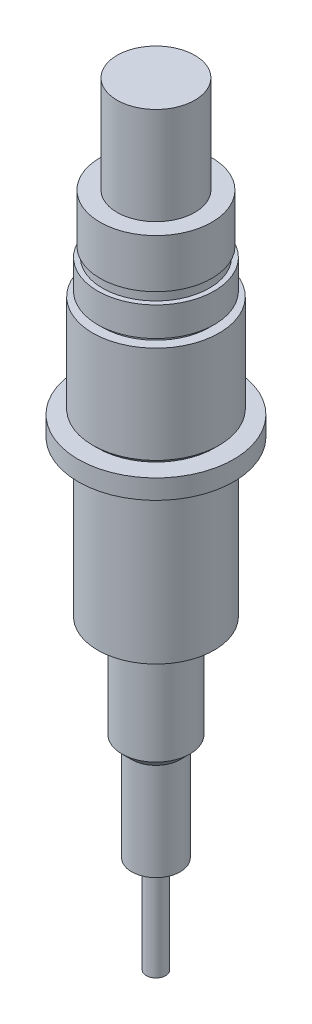
ISO-10303-21;
HEADER;
FILE_DESCRIPTION(('STEP AP214'),'2;1');
FILE_NAME('part.step','',(''),(''),'','','');
FILE_SCHEMA(('AUTOMOTIVE_DESIGN { 1 0 10303 214 1 1 1 1 }'));
ENDSEC;
DATA;
#1=APPLICATION_CONTEXT('core data for automotive mechanical design processes');
#2=APPLICATION_PROTOCOL_DEFINITION('international standard','automotive_design',2000,#1);
#3=PRODUCT_CONTEXT('',#1,'mechanical');
#4=PRODUCT('Part','Part','',(#3));
#5=PRODUCT_RELATED_PRODUCT_CATEGORY('part','',(#4));
#6=PRODUCT_DEFINITION_FORMATION('','',#4);
#7=PRODUCT_DEFINITION_CONTEXT('part definition',#1,'design');
#8=PRODUCT_DEFINITION('design','',#6,#7);
#9=PRODUCT_DEFINITION_SHAPE('','',#8);
#10=(LENGTH_UNIT() NAMED_UNIT(*) SI_UNIT(.MILLI.,.METRE.));
#11=(NAMED_UNIT(*) PLANE_ANGLE_UNIT() SI_UNIT($,.RADIAN.));
#12=(NAMED_UNIT(*) SI_UNIT($,.STERADIAN.) SOLID_ANGLE_UNIT());
#13=UNCERTAINTY_MEASURE_WITH_UNIT(LENGTH_MEASURE(1.E-05),#10,'distance_accuracy_value','');
#14=(GEOMETRIC_REPRESENTATION_CONTEXT(3) GLOBAL_UNCERTAINTY_ASSIGNED_CONTEXT((#13)) GLOBAL_UNIT_ASSIGNED_CONTEXT((#10,
#11,#12)) REPRESENTATION_CONTEXT('',''));
#15=CARTESIAN_POINT('',(0.,0.,0.));
#16=DIRECTION('',(0.,0.,1.));
#17=DIRECTION('',(1.,0.,0.));
#18=AXIS2_PLACEMENT_3D('',#15,#16,#17);
#19=CARTESIAN_POINT('',(0.,-47.5,0.));
#20=DIRECTION('',(0.,1.,0.));
#21=DIRECTION('',(0.,0.,1.));
#22=AXIS2_PLACEMENT_3D('',#19,#20,#21);
#23=PLANE('',#22);
#24=CARTESIAN_POINT('',(0.,-47.5,0.));
#25=DIRECTION('',(0.,1.,0.));
#26=DIRECTION('',(0.,0.,1.));
#27=AXIS2_PLACEMENT_3D('',#24,#25,#26);
#28=CIRCLE('',#27,1.);
#29=CARTESIAN_POINT('',(0.,-47.5,0.999999999999986));
#30=VERTEX_POINT('',#29);
#31=EDGE_CURVE('E10',#30,#30,#28,.T.);
#32=ORIENTED_EDGE('',*,*,#31,.F.);
#33=EDGE_LOOP('',(#32));
#34=FACE_BOUND('',#33,.T.);
#35=ADVANCED_FACE('F37',(#34),#23,.F.);
#36=CARTESIAN_POINT('',(0.,32.,0.));
#37=DIRECTION('',(0.,1.,0.));
#38=DIRECTION('',(0.,0.,1.));
#39=AXIS2_PLACEMENT_3D('',#36,#37,#38);
#40=CYLINDRICAL_SURFACE('',#39,1.);
#41=CARTESIAN_POINT('',(0.,-37.5,0.));
#42=DIRECTION('',(0.,1.,0.));
#43=DIRECTION('',(0.,0.,1.));
#44=AXIS2_PLACEMENT_3D('',#41,#42,#43);
#45=CIRCLE('',#44,1.);
#46=CARTESIAN_POINT('',(0.,-37.5,0.99999999999999));
#47=VERTEX_POINT('',#46);
#48=EDGE_CURVE('E44',#47,#47,#45,.T.);
#49=ORIENTED_EDGE('',*,*,#48,.F.);
#50=EDGE_LOOP('',(#49));
#51=FACE_BOUND('',#50,.T.);
#52=ORIENTED_EDGE('',*,*,#31,.T.);
#53=EDGE_LOOP('',(#52));
#54=FACE_BOUND('',#53,.T.);
#55=ADVANCED_FACE('F291',(#51,#54),#40,.T.);
#56=CARTESIAN_POINT('',(0.,-37.5,-1.00000000000001));
#57=DIRECTION('',(0.,1.,0.));
#58=DIRECTION('',(0.,0.,1.));
#59=AXIS2_PLACEMENT_3D('',#56,#57,#58);
#60=PLANE('',#59);
#61=CARTESIAN_POINT('',(0.,-37.5,0.));
#62=DIRECTION('',(0.,1.,0.));
#63=DIRECTION('',(0.,0.,1.));
#64=AXIS2_PLACEMENT_3D('',#61,#62,#63);
#65=CIRCLE('',#64,2.49999999999999);
#66=CARTESIAN_POINT('',(0.,-37.5,2.49999999999998));
#67=VERTEX_POINT('',#66);
#68=EDGE_CURVE('E49',#67,#67,#65,.T.);
#69=ORIENTED_EDGE('',*,*,#68,.F.);
#70=EDGE_LOOP('',(#69));
#71=FACE_BOUND('',#70,.T.);
#72=ORIENTED_EDGE('',*,*,#48,.T.);
#73=EDGE_LOOP('',(#72));
#74=FACE_BOUND('',#73,.T.);
#75=ADVANCED_FACE('F286',(#71,#74),#60,.F.);
#76=CARTESIAN_POINT('',(0.,32.,0.));
#77=DIRECTION('',(0.,1.,0.));
#78=DIRECTION('',(0.,0.,1.));
#79=AXIS2_PLACEMENT_3D('',#76,#77,#78);
#80=CYLINDRICAL_SURFACE('',#79,2.49999999999999);
#81=CARTESIAN_POINT('',(0.,-27.5,0.));
#82=DIRECTION('',(0.,1.,0.));
#83=DIRECTION('',(0.,0.,1.));
#84=AXIS2_PLACEMENT_3D('',#81,#82,#83);
#85=CIRCLE('',#84,2.5);
#86=CARTESIAN_POINT('',(0.,-27.5,2.49999999999999));
#87=VERTEX_POINT('',#86);
#88=EDGE_CURVE('E54',#87,#87,#85,.T.);
#89=ORIENTED_EDGE('',*,*,#88,.F.);
#90=EDGE_LOOP('',(#89));
#91=FACE_BOUND('',#90,.T.);
#92=ORIENTED_EDGE('',*,*,#68,.T.);
#93=EDGE_LOOP('',(#92));
#94=FACE_BOUND('',#93,.T.);
#95=ADVANCED_FACE('F280',(#91,#94),#80,.T.);
#96=CARTESIAN_POINT('',(0.,-27.5,0.));
#97=DIRECTION('',(0.,1.,0.));
#98=DIRECTION('',(0.,0.,1.));
#99=AXIS2_PLACEMENT_3D('',#96,#97,#98);
#100=CONICAL_SURFACE('',#99,2.5,0.785398163397448);
#101=CARTESIAN_POINT('',(0.,-26.5,0.));
#102=DIRECTION('',(0.,1.,0.));
#103=DIRECTION('',(0.,0.,1.));
#104=AXIS2_PLACEMENT_3D('',#101,#102,#103);
#105=CIRCLE('',#104,3.5);
#106=CARTESIAN_POINT('',(0.,-26.5,3.49999999999999));
#107=VERTEX_POINT('',#106);
#108=EDGE_CURVE('E60',#107,#107,#105,.T.);
#109=ORIENTED_EDGE('',*,*,#108,.F.);
#110=EDGE_LOOP('',(#109));
#111=FACE_BOUND('',#110,.T.);
#112=ORIENTED_EDGE('',*,*,#88,.T.);
#113=EDGE_LOOP('',(#112));
#114=FACE_BOUND('',#113,.T.);
#115=ADVANCED_FACE('F274',(#111,#114),#100,.T.);
#116=CARTESIAN_POINT('',(0.,32.,0.));
#117=DIRECTION('',(0.,1.,0.));
#118=DIRECTION('',(0.,0.,1.));
#119=AXIS2_PLACEMENT_3D('',#116,#117,#118);
#120=CYLINDRICAL_SURFACE('',#119,3.5);
#121=CARTESIAN_POINT('',(0.,-16.5,0.));
#122=DIRECTION('',(0.,1.,0.));
#123=DIRECTION('',(0.,0.,1.));
#124=AXIS2_PLACEMENT_3D('',#121,#122,#123);
#125=CIRCLE('',#124,3.5);
#126=CARTESIAN_POINT('',(0.,-16.5,3.49999999999999));
#127=VERTEX_POINT('',#126);
#128=EDGE_CURVE('E64',#127,#127,#125,.T.);
#129=ORIENTED_EDGE('',*,*,#128,.F.);
#130=EDGE_LOOP('',(#129));
#131=FACE_BOUND('',#130,.T.);
#132=ORIENTED_EDGE('',*,*,#108,.T.);
#133=EDGE_LOOP('',(#132));
#134=FACE_BOUND('',#133,.T.);
#135=ADVANCED_FACE('F268',(#131,#134),#120,.T.);
#136=CARTESIAN_POINT('',(0.,-16.5,-3.50000000000001));
#137=DIRECTION('',(0.,-1.,0.));
#138=DIRECTION('',(0.,0.,-1.));
#139=AXIS2_PLACEMENT_3D('',#136,#137,#138);
#140=PLANE('',#139);
#141=CARTESIAN_POINT('',(0.,-16.5,0.));
#142=DIRECTION('',(0.,1.,0.));
#143=DIRECTION('',(0.,0.,1.));
#144=AXIS2_PLACEMENT_3D('',#141,#142,#143);
#145=CIRCLE('',#144,3.);
#146=CARTESIAN_POINT('',(0.,-16.5,2.99999999999999));
#147=VERTEX_POINT('',#146);
#148=EDGE_CURVE('E68',#147,#147,#145,.T.);
#149=ORIENTED_EDGE('',*,*,#148,.F.);
#150=EDGE_LOOP('',(#149));
#151=FACE_BOUND('',#150,.T.);
#152=ORIENTED_EDGE('',*,*,#128,.T.);
#153=EDGE_LOOP('',(#152));
#154=FACE_BOUND('',#153,.T.);
#155=ADVANCED_FACE('F262',(#151,#154),#140,.F.);
#156=CARTESIAN_POINT('',(0.,32.,0.));
#157=DIRECTION('',(0.,1.,0.));
#158=DIRECTION('',(0.,0.,1.));
#159=AXIS2_PLACEMENT_3D('',#156,#157,#158);
#160=CYLINDRICAL_SURFACE('',#159,3.);
#161=CARTESIAN_POINT('',(0.,-16.,0.));
#162=DIRECTION('',(0.,1.,0.));
#163=DIRECTION('',(0.,0.,1.));
#164=AXIS2_PLACEMENT_3D('',#161,#162,#163);
#165=CIRCLE('',#164,3.);
#166=CARTESIAN_POINT('',(0.,-16.,2.99999999999999));
#167=VERTEX_POINT('',#166);
#168=EDGE_CURVE('E72',#167,#167,#165,.T.);
#169=ORIENTED_EDGE('',*,*,#168,.F.);
#170=EDGE_LOOP('',(#169));
#171=FACE_BOUND('',#170,.T.);
#172=ORIENTED_EDGE('',*,*,#148,.T.);
#173=EDGE_LOOP('',(#172));
#174=FACE_BOUND('',#173,.T.);
#175=ADVANCED_FACE('F256',(#171,#174),#160,.T.);
#176=CARTESIAN_POINT('',(0.,-16.,-3.00000000000001));
#177=DIRECTION('',(0.,1.,0.));
#178=DIRECTION('',(0.,0.,1.));
#179=AXIS2_PLACEMENT_3D('',#176,#177,#178);
#180=PLANE('',#179);
#181=CARTESIAN_POINT('',(0.,-16.,0.));
#182=DIRECTION('',(0.,1.,0.));
#183=DIRECTION('',(0.,0.,1.));
#184=AXIS2_PLACEMENT_3D('',#181,#182,#183);
#185=CIRCLE('',#184,6.);
#186=CARTESIAN_POINT('',(0.,-16.,5.99999999999999));
#187=VERTEX_POINT('',#186);
#188=EDGE_CURVE('E76',#187,#187,#185,.T.);
#189=ORIENTED_EDGE('',*,*,#188,.F.);
#190=EDGE_LOOP('',(#189));
#191=FACE_BOUND('',#190,.T.);
#192=ORIENTED_EDGE('',*,*,#168,.T.);
#193=EDGE_LOOP('',(#192));
#194=FACE_BOUND('',#193,.T.);
#195=ADVANCED_FACE('F250',(#191,#194),#180,.F.);
#196=CARTESIAN_POINT('',(0.,32.,0.));
#197=DIRECTION('',(0.,1.,0.));
#198=DIRECTION('',(0.,0.,1.));
#199=AXIS2_PLACEMENT_3D('',#196,#197,#198);
#200=CYLINDRICAL_SURFACE('',#199,6.);
#201=CARTESIAN_POINT('',(0.,-1.,0.));
#202=DIRECTION('',(0.,1.,0.));
#203=DIRECTION('',(0.,0.,1.));
#204=AXIS2_PLACEMENT_3D('',#201,#202,#203);
#205=CIRCLE('',#204,6.00000000000001);
#206=CARTESIAN_POINT('',(0.,-1.,6.));
#207=VERTEX_POINT('',#206);
#208=EDGE_CURVE('E80',#207,#207,#205,.T.);
#209=ORIENTED_EDGE('',*,*,#208,.F.);
#210=EDGE_LOOP('',(#209));
#211=FACE_BOUND('',#210,.T.);
#212=ORIENTED_EDGE('',*,*,#188,.T.);
#213=EDGE_LOOP('',(#212));
#214=FACE_BOUND('',#213,.T.);
#215=ADVANCED_FACE('F244',(#211,#214),#200,.T.);
#216=CARTESIAN_POINT('',(0.,-1.,0.));
#217=DIRECTION('',(0.,-1.,0.));
#218=DIRECTION('',(0.,0.,-1.));
#219=AXIS2_PLACEMENT_3D('',#216,#217,#218);
#220=CONICAL_SURFACE('',#219,6.00000000000001,0.785398163397452);
#221=CARTESIAN_POINT('',(0.,0.,0.));
#222=DIRECTION('',(0.,1.,0.));
#223=DIRECTION('',(0.,0.,1.));
#224=AXIS2_PLACEMENT_3D('',#221,#222,#223);
#225=CIRCLE('',#224,5.);
#226=CARTESIAN_POINT('',(0.,0.,4.99999999999999));
#227=VERTEX_POINT('',#226);
#228=EDGE_CURVE('E84',#227,#227,#225,.T.);
#229=ORIENTED_EDGE('',*,*,#228,.F.);
#230=EDGE_LOOP('',(#229));
#231=FACE_BOUND('',#230,.T.);
#232=ORIENTED_EDGE('',*,*,#208,.T.);
#233=EDGE_LOOP('',(#232));
#234=FACE_BOUND('',#233,.T.);
#235=ADVANCED_FACE('F238',(#231,#234),#220,.T.);
#236=CARTESIAN_POINT('',(0.,0.,-5.));
#237=DIRECTION('',(0.,1.,0.));
#238=DIRECTION('',(0.,0.,1.));
#239=AXIS2_PLACEMENT_3D('',#236,#237,#238);
#240=PLANE('',#239);
#241=CARTESIAN_POINT('',(0.,0.,0.));
#242=DIRECTION('',(0.,1.,0.));
#243=DIRECTION('',(0.,0.,1.));
#244=AXIS2_PLACEMENT_3D('',#241,#242,#243);
#245=CIRCLE('',#244,8.);
#246=CARTESIAN_POINT('',(0.,0.,7.99999999999999));
#247=VERTEX_POINT('',#246);
#248=EDGE_CURVE('E88',#247,#247,#245,.T.);
#249=ORIENTED_EDGE('',*,*,#248,.F.);
#250=EDGE_LOOP('',(#249));
#251=FACE_BOUND('',#250,.T.);
#252=ORIENTED_EDGE('',*,*,#228,.T.);
#253=EDGE_LOOP('',(#252));
#254=FACE_BOUND('',#253,.T.);
#255=ADVANCED_FACE('F232',(#251,#254),#240,.F.);
#256=CARTESIAN_POINT('',(0.,32.,0.));
#257=DIRECTION('',(0.,1.,0.));
#258=DIRECTION('',(0.,0.,1.));
#259=AXIS2_PLACEMENT_3D('',#256,#257,#258);
#260=CYLINDRICAL_SURFACE('',#259,8.);
#261=CARTESIAN_POINT('',(0.,2.,0.));
#262=DIRECTION('',(0.,1.,0.));
#263=DIRECTION('',(0.,0.,1.));
#264=AXIS2_PLACEMENT_3D('',#261,#262,#263);
#265=CIRCLE('',#264,8.);
#266=CARTESIAN_POINT('',(0.,2.,7.99999999999999));
#267=VERTEX_POINT('',#266);
#268=EDGE_CURVE('E92',#267,#267,#265,.T.);
#269=ORIENTED_EDGE('',*,*,#268,.F.);
#270=EDGE_LOOP('',(#269));
#271=FACE_BOUND('',#270,.T.);
#272=ORIENTED_EDGE('',*,*,#248,.T.);
#273=EDGE_LOOP('',(#272));
#274=FACE_BOUND('',#273,.T.);
#275=ADVANCED_FACE('F226',(#271,#274),#260,.T.);
#276=CARTESIAN_POINT('',(0.,2.,-8.));
#277=DIRECTION('',(0.,-1.,0.));
#278=DIRECTION('',(0.,0.,-1.));
#279=AXIS2_PLACEMENT_3D('',#276,#277,#278);
#280=PLANE('',#279);
#281=CARTESIAN_POINT('',(0.,2.,0.));
#282=DIRECTION('',(0.,1.,0.));
#283=DIRECTION('',(0.,0.,1.));
#284=AXIS2_PLACEMENT_3D('',#281,#282,#283);
#285=CIRCLE('',#284,6.);
#286=CARTESIAN_POINT('',(0.,2.,5.99999999999999));
#287=VERTEX_POINT('',#286);
#288=EDGE_CURVE('E96',#287,#287,#285,.T.);
#289=ORIENTED_EDGE('',*,*,#288,.F.);
#290=EDGE_LOOP('',(#289));
#291=FACE_BOUND('',#290,.T.);
#292=ORIENTED_EDGE('',*,*,#268,.T.);
#293=EDGE_LOOP('',(#292));
#294=FACE_BOUND('',#293,.T.);
#295=ADVANCED_FACE('F220',(#291,#294),#280,.F.);
#296=CARTESIAN_POINT('',(0.,2.,0.));
#297=DIRECTION('',(0.,1.,0.));
#298=DIRECTION('',(0.,0.,1.));
#299=AXIS2_PLACEMENT_3D('',#296,#297,#298);
#300=CONICAL_SURFACE('',#299,6.,0.785398163397453);
#301=CARTESIAN_POINT('',(0.,2.49999999999999,0.));
#302=DIRECTION('',(0.,1.,0.));
#303=DIRECTION('',(0.,0.,1.));
#304=AXIS2_PLACEMENT_3D('',#301,#302,#303);
#305=CIRCLE('',#304,6.5);
#306=CARTESIAN_POINT('',(0.,2.49999999999999,6.49999999999999));
#307=VERTEX_POINT('',#306);
#308=EDGE_CURVE('E100',#307,#307,#305,.T.);
#309=ORIENTED_EDGE('',*,*,#308,.F.);
#310=EDGE_LOOP('',(#309));
#311=FACE_BOUND('',#310,.T.);
#312=ORIENTED_EDGE('',*,*,#288,.T.);
#313=EDGE_LOOP('',(#312));
#314=FACE_BOUND('',#313,.T.);
#315=ADVANCED_FACE('F214',(#311,#314),#300,.T.);
#316=CARTESIAN_POINT('',(0.,32.,0.));
#317=DIRECTION('',(0.,1.,0.));
#318=DIRECTION('',(0.,0.,1.));
#319=AXIS2_PLACEMENT_3D('',#316,#317,#318);
#320=CYLINDRICAL_SURFACE('',#319,6.5);
#321=CARTESIAN_POINT('',(0.,12.5,0.));
#322=DIRECTION('',(0.,1.,0.));
#323=DIRECTION('',(0.,0.,1.));
#324=AXIS2_PLACEMENT_3D('',#321,#322,#323);
#325=CIRCLE('',#324,6.5);
#326=CARTESIAN_POINT('',(0.,12.5,6.5));
#327=VERTEX_POINT('',#326);
#328=EDGE_CURVE('E104',#327,#327,#325,.T.);
#329=ORIENTED_EDGE('',*,*,#328,.F.);
#330=EDGE_LOOP('',(#329));
#331=FACE_BOUND('',#330,.T.);
#332=ORIENTED_EDGE('',*,*,#308,.T.);
#333=EDGE_LOOP('',(#332));
#334=FACE_BOUND('',#333,.T.);
#335=ADVANCED_FACE('F208',(#331,#334),#320,.T.);
#336=CARTESIAN_POINT('',(0.,12.5,-6.5));
#337=DIRECTION('',(0.,-1.,0.));
#338=DIRECTION('',(0.,0.,-1.));
#339=AXIS2_PLACEMENT_3D('',#336,#337,#338);
#340=PLANE('',#339);
#341=CARTESIAN_POINT('',(0.,12.5,0.));
#342=DIRECTION('',(0.,1.,0.));
#343=DIRECTION('',(0.,0.,1.));
#344=AXIS2_PLACEMENT_3D('',#341,#342,#343);
#345=CIRCLE('',#344,5.5);
#346=CARTESIAN_POINT('',(0.,12.5,5.5));
#347=VERTEX_POINT('',#346);
#348=EDGE_CURVE('E108',#347,#347,#345,.T.);
#349=ORIENTED_EDGE('',*,*,#348,.F.);
#350=EDGE_LOOP('',(#349));
#351=FACE_BOUND('',#350,.T.);
#352=ORIENTED_EDGE('',*,*,#328,.T.);
#353=EDGE_LOOP('',(#352));
#354=FACE_BOUND('',#353,.T.);
#355=ADVANCED_FACE('F202',(#351,#354),#340,.F.);
#356=CARTESIAN_POINT('',(0.,32.,0.));
#357=DIRECTION('',(0.,1.,0.));
#358=DIRECTION('',(0.,0.,1.));
#359=AXIS2_PLACEMENT_3D('',#356,#357,#358);
#360=CYLINDRICAL_SURFACE('',#359,5.5);
#361=CARTESIAN_POINT('',(0.,13.,0.));
#362=DIRECTION('',(0.,1.,0.));
#363=DIRECTION('',(0.,0.,1.));
#364=AXIS2_PLACEMENT_3D('',#361,#362,#363);
#365=CIRCLE('',#364,5.5);
#366=CARTESIAN_POINT('',(0.,13.,5.5));
#367=VERTEX_POINT('',#366);
#368=EDGE_CURVE('E112',#367,#367,#365,.T.);
#369=ORIENTED_EDGE('',*,*,#368,.F.);
#370=EDGE_LOOP('',(#369));
#371=FACE_BOUND('',#370,.T.);
#372=ORIENTED_EDGE('',*,*,#348,.T.);
#373=EDGE_LOOP('',(#372));
#374=FACE_BOUND('',#373,.T.);
#375=ADVANCED_FACE('F196',(#371,#374),#360,.T.);
#376=CARTESIAN_POINT('',(0.,13.,-5.50000000000001));
#377=DIRECTION('',(0.,1.,0.));
#378=DIRECTION('',(0.,0.,1.));
#379=AXIS2_PLACEMENT_3D('',#376,#377,#378);
#380=PLANE('',#379);
#381=CARTESIAN_POINT('',(0.,13.,0.));
#382=DIRECTION('',(0.,1.,0.));
#383=DIRECTION('',(0.,0.,1.));
#384=AXIS2_PLACEMENT_3D('',#381,#382,#383);
#385=CIRCLE('',#384,6.);
#386=CARTESIAN_POINT('',(0.,13.,6.));
#387=VERTEX_POINT('',#386);
#388=EDGE_CURVE('E116',#387,#387,#385,.T.);
#389=ORIENTED_EDGE('',*,*,#388,.F.);
#390=EDGE_LOOP('',(#389));
#391=FACE_BOUND('',#390,.T.);
#392=ORIENTED_EDGE('',*,*,#368,.T.);
#393=EDGE_LOOP('',(#392));
#394=FACE_BOUND('',#393,.T.);
#395=ADVANCED_FACE('F190',(#391,#394),#380,.F.);
#396=CARTESIAN_POINT('',(0.,32.,0.));
#397=DIRECTION('',(0.,1.,0.));
#398=DIRECTION('',(0.,0.,1.));
#399=AXIS2_PLACEMENT_3D('',#396,#397,#398);
#400=CYLINDRICAL_SURFACE('',#399,6.);
#401=CARTESIAN_POINT('',(0.,16.,0.));
#402=DIRECTION('',(0.,1.,0.));
#403=DIRECTION('',(0.,0.,1.));
#404=AXIS2_PLACEMENT_3D('',#401,#402,#403);
#405=CIRCLE('',#404,6.);
#406=CARTESIAN_POINT('',(0.,16.,6.));
#407=VERTEX_POINT('',#406);
#408=EDGE_CURVE('E120',#407,#407,#405,.T.);
#409=ORIENTED_EDGE('',*,*,#408,.F.);
#410=EDGE_LOOP('',(#409));
#411=FACE_BOUND('',#410,.T.);
#412=ORIENTED_EDGE('',*,*,#388,.T.);
#413=EDGE_LOOP('',(#412));
#414=FACE_BOUND('',#413,.T.);
#415=ADVANCED_FACE('F184',(#411,#414),#400,.T.);
#416=CARTESIAN_POINT('',(0.,16.,-6.));
#417=DIRECTION('',(0.,-1.,0.));
#418=DIRECTION('',(0.,0.,-1.));
#419=AXIS2_PLACEMENT_3D('',#416,#417,#418);
#420=PLANE('',#419);
#421=CARTESIAN_POINT('',(0.,16.,0.));
#422=DIRECTION('',(0.,1.,0.));
#423=DIRECTION('',(0.,0.,1.));
#424=AXIS2_PLACEMENT_3D('',#421,#422,#423);
#425=CIRCLE('',#424,5.5);
#426=CARTESIAN_POINT('',(0.,16.,5.5));
#427=VERTEX_POINT('',#426);
#428=EDGE_CURVE('E124',#427,#427,#425,.T.);
#429=ORIENTED_EDGE('',*,*,#428,.F.);
#430=EDGE_LOOP('',(#429));
#431=FACE_BOUND('',#430,.T.);
#432=ORIENTED_EDGE('',*,*,#408,.T.);
#433=EDGE_LOOP('',(#432));
#434=FACE_BOUND('',#433,.T.);
#435=ADVANCED_FACE('F178',(#431,#434),#420,.F.);
#436=CARTESIAN_POINT('',(0.,32.,0.));
#437=DIRECTION('',(0.,1.,0.));
#438=DIRECTION('',(0.,0.,1.));
#439=AXIS2_PLACEMENT_3D('',#436,#437,#438);
#440=CYLINDRICAL_SURFACE('',#439,5.5);
#441=CARTESIAN_POINT('',(0.,17.,0.));
#442=DIRECTION('',(0.,1.,0.));
#443=DIRECTION('',(0.,0.,1.));
#444=AXIS2_PLACEMENT_3D('',#441,#442,#443);
#445=CIRCLE('',#444,5.5);
#446=CARTESIAN_POINT('',(0.,17.,5.5));
#447=VERTEX_POINT('',#446);
#448=EDGE_CURVE('E128',#447,#447,#445,.T.);
#449=ORIENTED_EDGE('',*,*,#448,.F.);
#450=EDGE_LOOP('',(#449));
#451=FACE_BOUND('',#450,.T.);
#452=ORIENTED_EDGE('',*,*,#428,.T.);
#453=EDGE_LOOP('',(#452));
#454=FACE_BOUND('',#453,.T.);
#455=ADVANCED_FACE('F172',(#451,#454),#440,.T.);
#456=CARTESIAN_POINT('',(0.,17.,-5.5));
#457=DIRECTION('',(0.,1.,0.));
#458=DIRECTION('',(0.,0.,1.));
#459=AXIS2_PLACEMENT_3D('',#456,#457,#458);
#460=PLANE('',#459);
#461=CARTESIAN_POINT('',(0.,17.,0.));
#462=DIRECTION('',(0.,1.,0.));
#463=DIRECTION('',(0.,0.,1.));
#464=AXIS2_PLACEMENT_3D('',#461,#462,#463);
#465=CIRCLE('',#464,5.75);
#466=CARTESIAN_POINT('',(0.,17.,5.75));
#467=VERTEX_POINT('',#466);
#468=EDGE_CURVE('E132',#467,#467,#465,.T.);
#469=ORIENTED_EDGE('',*,*,#468,.F.);
#470=EDGE_LOOP('',(#469));
#471=FACE_BOUND('',#470,.T.);
#472=ORIENTED_EDGE('',*,*,#448,.T.);
#473=EDGE_LOOP('',(#472));
#474=FACE_BOUND('',#473,.T.);
#475=ADVANCED_FACE('F166',(#471,#474),#460,.F.);
#476=CARTESIAN_POINT('',(0.,32.,0.));
#477=DIRECTION('',(0.,1.,0.));
#478=DIRECTION('',(0.,0.,1.));
#479=AXIS2_PLACEMENT_3D('',#476,#477,#478);
#480=CYLINDRICAL_SURFACE('',#479,5.75);
#481=CARTESIAN_POINT('',(0.,22.,0.));
#482=DIRECTION('',(0.,1.,0.));
#483=DIRECTION('',(0.,0.,1.));
#484=AXIS2_PLACEMENT_3D('',#481,#482,#483);
#485=CIRCLE('',#484,5.75);
#486=CARTESIAN_POINT('',(0.,22.,5.75));
#487=VERTEX_POINT('',#486);
#488=EDGE_CURVE('E136',#487,#487,#485,.T.);
#489=ORIENTED_EDGE('',*,*,#488,.F.);
#490=EDGE_LOOP('',(#489));
#491=FACE_BOUND('',#490,.T.);
#492=ORIENTED_EDGE('',*,*,#468,.T.);
#493=EDGE_LOOP('',(#492));
#494=FACE_BOUND('',#493,.T.);
#495=ADVANCED_FACE('F160',(#491,#494),#480,.T.);
#496=CARTESIAN_POINT('',(0.,22.,-5.75));
#497=DIRECTION('',(0.,-1.,0.));
#498=DIRECTION('',(0.,0.,-1.));
#499=AXIS2_PLACEMENT_3D('',#496,#497,#498);
#500=PLANE('',#499);
#501=CARTESIAN_POINT('',(0.,22.,0.));
#502=DIRECTION('',(0.,1.,0.));
#503=DIRECTION('',(0.,0.,1.));
#504=AXIS2_PLACEMENT_3D('',#501,#502,#503);
#505=CIRCLE('',#504,4.);
#506=CARTESIAN_POINT('',(0.,22.,4.));
#507=VERTEX_POINT('',#506);
#508=EDGE_CURVE('E140',#507,#507,#505,.T.);
#509=ORIENTED_EDGE('',*,*,#508,.F.);
#510=EDGE_LOOP('',(#509));
#511=FACE_BOUND('',#510,.T.);
#512=ORIENTED_EDGE('',*,*,#488,.T.);
#513=EDGE_LOOP('',(#512));
#514=FACE_BOUND('',#513,.T.);
#515=ADVANCED_FACE('F154',(#511,#514),#500,.F.);
#516=CARTESIAN_POINT('',(0.,32.,0.));
#517=DIRECTION('',(0.,1.,0.));
#518=DIRECTION('',(0.,0.,1.));
#519=AXIS2_PLACEMENT_3D('',#516,#517,#518);
#520=CYLINDRICAL_SURFACE('',#519,4.);
#521=CARTESIAN_POINT('',(0.,32.,0.));
#522=DIRECTION('',(0.,1.,0.));
#523=DIRECTION('',(0.,0.,1.));
#524=AXIS2_PLACEMENT_3D('',#521,#522,#523);
#525=CIRCLE('',#524,4.);
#526=CARTESIAN_POINT('',(0.,32.,4.));
#527=VERTEX_POINT('',#526);
#528=EDGE_CURVE('E144',#527,#527,#525,.T.);
#529=ORIENTED_EDGE('',*,*,#528,.F.);
#530=EDGE_LOOP('',(#529));
#531=FACE_BOUND('',#530,.T.);
#532=ORIENTED_EDGE('',*,*,#508,.T.);
#533=EDGE_LOOP('',(#532));
#534=FACE_BOUND('',#533,.T.);
#535=ADVANCED_FACE('F151',(#531,#534),#520,.T.);
#536=CARTESIAN_POINT('',(0.,32.,0.));
#537=DIRECTION('',(0.,-1.,0.));
#538=DIRECTION('',(0.,0.,-1.));
#539=AXIS2_PLACEMENT_3D('',#536,#537,#538);
#540=PLANE('',#539);
#541=ORIENTED_EDGE('',*,*,#528,.T.);
#542=EDGE_LOOP('',(#541));
#543=FACE_BOUND('',#542,.T.);
#544=ADVANCED_FACE('F149',(#543),#540,.F.);
#545=CLOSED_SHELL('',(#35,#55,#75,#95,#115,#135,#155,#175,#195,#215,#235,#255,#275,#295,#315,
#335,#355,#375,#395,#415,#435,#455,#475,#495,#515,#535,#544));
#546=MANIFOLD_SOLID_BREP('B2',#545);
#547=ADVANCED_BREP_SHAPE_REPRESENTATION('',(#18,#546),#14);
#548=SHAPE_DEFINITION_REPRESENTATION(#9,#547);
ENDSEC;
END-ISO-10303-21;
